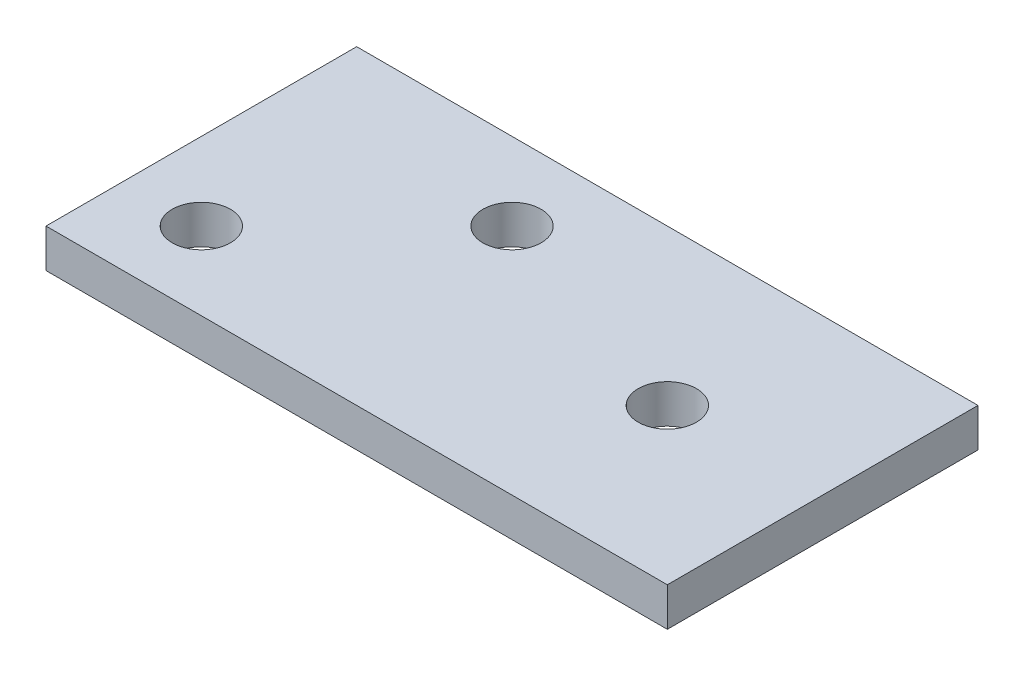
ISO-10303-21;
HEADER;
FILE_DESCRIPTION(('STEP AP214'),'2;1');
FILE_NAME('part.step','',(''),(''),'','','');
FILE_SCHEMA(('AUTOMOTIVE_DESIGN { 1 0 10303 214 1 1 1 1 }'));
ENDSEC;
DATA;
#1=APPLICATION_CONTEXT('core data for automotive mechanical design processes');
#2=APPLICATION_PROTOCOL_DEFINITION('international standard','automotive_design',2000,#1);
#3=PRODUCT_CONTEXT('',#1,'mechanical');
#4=PRODUCT('Part','Part','',(#3));
#5=PRODUCT_RELATED_PRODUCT_CATEGORY('part','',(#4));
#6=PRODUCT_DEFINITION_FORMATION('','',#4);
#7=PRODUCT_DEFINITION_CONTEXT('part definition',#1,'design');
#8=PRODUCT_DEFINITION('design','',#6,#7);
#9=PRODUCT_DEFINITION_SHAPE('','',#8);
#10=(LENGTH_UNIT() NAMED_UNIT(*) SI_UNIT(.MILLI.,.METRE.));
#11=(NAMED_UNIT(*) PLANE_ANGLE_UNIT() SI_UNIT($,.RADIAN.));
#12=(NAMED_UNIT(*) SI_UNIT($,.STERADIAN.) SOLID_ANGLE_UNIT());
#13=UNCERTAINTY_MEASURE_WITH_UNIT(LENGTH_MEASURE(1.E-05),#10,'distance_accuracy_value','');
#14=(GEOMETRIC_REPRESENTATION_CONTEXT(3) GLOBAL_UNCERTAINTY_ASSIGNED_CONTEXT((#13)) GLOBAL_UNIT_ASSIGNED_CONTEXT((#10,
#11,#12)) REPRESENTATION_CONTEXT('',''));
#15=CARTESIAN_POINT('',(0.,0.,0.));
#16=DIRECTION('',(0.,0.,1.));
#17=DIRECTION('',(1.,0.,0.));
#18=AXIS2_PLACEMENT_3D('',#15,#16,#17);
#19=CARTESIAN_POINT('',(50.8,6.31,-25.4));
#20=DIRECTION('',(-1.,0.,0.));
#21=DIRECTION('',(0.,0.,1.));
#22=AXIS2_PLACEMENT_3D('',#19,#20,#21);
#23=PLANE('',#22);
#24=DIRECTION('',(0.,0.,-1.));
#25=VECTOR('',#24,1.);
#26=CARTESIAN_POINT('',(50.8,0.,-25.4));
#27=LINE('',#26,#25);
#28=CARTESIAN_POINT('',(50.8,0.,25.4));
#29=VERTEX_POINT('',#28);
#30=CARTESIAN_POINT('',(50.8,0.,-25.4));
#31=VERTEX_POINT('',#30);
#32=EDGE_CURVE('E97',#29,#31,#27,.T.);
#33=ORIENTED_EDGE('',*,*,#32,.T.);
#34=DIRECTION('',(0.,-1.,0.));
#35=VECTOR('',#34,1.);
#36=CARTESIAN_POINT('',(50.8,6.31,-25.4));
#37=LINE('',#36,#35);
#38=CARTESIAN_POINT('',(50.8,6.31,-25.4));
#39=VERTEX_POINT('',#38);
#40=EDGE_CURVE('E11',#39,#31,#37,.T.);
#41=ORIENTED_EDGE('',*,*,#40,.F.);
#42=DIRECTION('',(0.,0.,-1.));
#43=VECTOR('',#42,1.);
#44=CARTESIAN_POINT('',(50.8,6.31,-25.4));
#45=LINE('',#44,#43);
#46=CARTESIAN_POINT('',(50.8,6.31,25.4));
#47=VERTEX_POINT('',#46);
#48=EDGE_CURVE('E84',#47,#39,#45,.T.);
#49=ORIENTED_EDGE('',*,*,#48,.F.);
#50=DIRECTION('',(0.,-1.,0.));
#51=VECTOR('',#50,1.);
#52=CARTESIAN_POINT('',(50.8,6.31,25.4));
#53=LINE('',#52,#51);
#54=EDGE_CURVE('E93',#47,#29,#53,.T.);
#55=ORIENTED_EDGE('',*,*,#54,.T.);
#56=EDGE_LOOP('',(#33,#41,#49,#55));
#57=FACE_BOUND('',#56,.T.);
#58=ADVANCED_FACE('F32',(#57),#23,.F.);
#59=CARTESIAN_POINT('',(-50.8,6.31,-25.4));
#60=DIRECTION('',(0.,0.,1.));
#61=DIRECTION('',(1.,0.,0.));
#62=AXIS2_PLACEMENT_3D('',#59,#60,#61);
#63=PLANE('',#62);
#64=DIRECTION('',(-1.,0.,0.));
#65=VECTOR('',#64,1.);
#66=CARTESIAN_POINT('',(-50.8,0.,-25.4));
#67=LINE('',#66,#65);
#68=CARTESIAN_POINT('',(-50.8,0.,-25.4));
#69=VERTEX_POINT('',#68);
#70=EDGE_CURVE('E88',#31,#69,#67,.T.);
#71=ORIENTED_EDGE('',*,*,#70,.T.);
#72=DIRECTION('',(0.,-1.,0.));
#73=VECTOR('',#72,1.);
#74=CARTESIAN_POINT('',(-50.8,6.31,-25.4));
#75=LINE('',#74,#73);
#76=CARTESIAN_POINT('',(-50.8,6.31,-25.4));
#77=VERTEX_POINT('',#76);
#78=EDGE_CURVE('E41',#77,#69,#75,.T.);
#79=ORIENTED_EDGE('',*,*,#78,.F.);
#80=DIRECTION('',(-1.,0.,0.));
#81=VECTOR('',#80,1.);
#82=CARTESIAN_POINT('',(-50.8,6.31,-25.4));
#83=LINE('',#82,#81);
#84=EDGE_CURVE('E79',#39,#77,#83,.T.);
#85=ORIENTED_EDGE('',*,*,#84,.F.);
#86=ORIENTED_EDGE('',*,*,#40,.T.);
#87=EDGE_LOOP('',(#71,#79,#85,#86));
#88=FACE_BOUND('',#87,.T.);
#89=ADVANCED_FACE('F87',(#88),#63,.F.);
#90=CARTESIAN_POINT('',(-50.8,6.31,-25.4));
#91=DIRECTION('',(1.,0.,0.));
#92=DIRECTION('',(0.,0.,-1.));
#93=AXIS2_PLACEMENT_3D('',#90,#91,#92);
#94=PLANE('',#93);
#95=DIRECTION('',(0.,0.,1.));
#96=VECTOR('',#95,1.);
#97=CARTESIAN_POINT('',(-50.8,0.,-25.4));
#98=LINE('',#97,#96);
#99=CARTESIAN_POINT('',(-50.8,0.,25.4));
#100=VERTEX_POINT('',#99);
#101=EDGE_CURVE('E66',#69,#100,#98,.T.);
#102=ORIENTED_EDGE('',*,*,#101,.T.);
#103=DIRECTION('',(0.,-1.,0.));
#104=VECTOR('',#103,1.);
#105=CARTESIAN_POINT('',(-50.8,6.31,25.4));
#106=LINE('',#105,#104);
#107=CARTESIAN_POINT('',(-50.8,6.31,25.4));
#108=VERTEX_POINT('',#107);
#109=EDGE_CURVE('E89',#108,#100,#106,.T.);
#110=ORIENTED_EDGE('',*,*,#109,.F.);
#111=DIRECTION('',(0.,0.,1.));
#112=VECTOR('',#111,1.);
#113=CARTESIAN_POINT('',(-50.8,6.31,-25.4));
#114=LINE('',#113,#112);
#115=EDGE_CURVE('E82',#77,#108,#114,.T.);
#116=ORIENTED_EDGE('',*,*,#115,.F.);
#117=ORIENTED_EDGE('',*,*,#78,.T.);
#118=EDGE_LOOP('',(#102,#110,#116,#117));
#119=FACE_BOUND('',#118,.T.);
#120=ADVANCED_FACE('F91',(#119),#94,.F.);
#121=CARTESIAN_POINT('',(-50.8,6.31,25.4));
#122=DIRECTION('',(0.,0.,-1.));
#123=DIRECTION('',(-1.,0.,0.));
#124=AXIS2_PLACEMENT_3D('',#121,#122,#123);
#125=PLANE('',#124);
#126=DIRECTION('',(1.,0.,0.));
#127=VECTOR('',#126,1.);
#128=CARTESIAN_POINT('',(-50.8,0.,25.4));
#129=LINE('',#128,#127);
#130=EDGE_CURVE('E72',#100,#29,#129,.T.);
#131=ORIENTED_EDGE('',*,*,#130,.T.);
#132=ORIENTED_EDGE('',*,*,#54,.F.);
#133=DIRECTION('',(1.,0.,0.));
#134=VECTOR('',#133,1.);
#135=CARTESIAN_POINT('',(-50.8,6.31,25.4));
#136=LINE('',#135,#134);
#137=EDGE_CURVE('E49',#108,#47,#136,.T.);
#138=ORIENTED_EDGE('',*,*,#137,.F.);
#139=ORIENTED_EDGE('',*,*,#109,.T.);
#140=EDGE_LOOP('',(#131,#132,#138,#139));
#141=FACE_BOUND('',#140,.T.);
#142=ADVANCED_FACE('F105',(#141),#125,.F.);
#143=CARTESIAN_POINT('',(0.,6.31,0.));
#144=DIRECTION('',(0.,1.,0.));
#145=DIRECTION('',(0.,0.,1.));
#146=AXIS2_PLACEMENT_3D('',#143,#144,#145);
#147=PLANE('',#146);
#148=CARTESIAN_POINT('',(25.4,6.31,0.));
#149=DIRECTION('',(0.,1.,0.));
#150=DIRECTION('',(0.,0.,1.));
#151=AXIS2_PLACEMENT_3D('',#148,#149,#150);
#152=CIRCLE('',#151,4.7625);
#153=CARTESIAN_POINT('',(25.4,6.31,4.7625));
#154=VERTEX_POINT('',#153);
#155=EDGE_CURVE('E122',#154,#154,#152,.T.);
#156=ORIENTED_EDGE('',*,*,#155,.F.);
#157=EDGE_LOOP('',(#156));
#158=FACE_BOUND('',#157,.T.);
#159=CARTESIAN_POINT('',(-12.7,6.31,-12.7));
#160=DIRECTION('',(0.,1.,0.));
#161=DIRECTION('',(0.,0.,1.));
#162=AXIS2_PLACEMENT_3D('',#159,#160,#161);
#163=CIRCLE('',#162,4.7625);
#164=CARTESIAN_POINT('',(-12.7,6.31,-7.9375));
#165=VERTEX_POINT('',#164);
#166=EDGE_CURVE('E117',#165,#165,#163,.T.);
#167=ORIENTED_EDGE('',*,*,#166,.F.);
#168=EDGE_LOOP('',(#167));
#169=FACE_BOUND('',#168,.T.);
#170=CARTESIAN_POINT('',(-38.1,6.31,12.7));
#171=DIRECTION('',(0.,1.,0.));
#172=DIRECTION('',(0.,0.,1.));
#173=AXIS2_PLACEMENT_3D('',#170,#171,#172);
#174=CIRCLE('',#173,4.7625);
#175=CARTESIAN_POINT('',(-38.1,6.31,17.4625));
#176=VERTEX_POINT('',#175);
#177=EDGE_CURVE('E111',#176,#176,#174,.T.);
#178=ORIENTED_EDGE('',*,*,#177,.F.);
#179=EDGE_LOOP('',(#178));
#180=FACE_BOUND('',#179,.T.);
#181=ORIENTED_EDGE('',*,*,#48,.T.);
#182=ORIENTED_EDGE('',*,*,#84,.T.);
#183=ORIENTED_EDGE('',*,*,#115,.T.);
#184=ORIENTED_EDGE('',*,*,#137,.T.);
#185=EDGE_LOOP('',(#181,#182,#183,#184));
#186=FACE_BOUND('',#185,.T.);
#187=ADVANCED_FACE('F80',(#158,#169,#180,#186),#147,.T.);
#188=CARTESIAN_POINT('',(0.,0.,0.));
#189=DIRECTION('',(0.,1.,0.));
#190=DIRECTION('',(0.,0.,1.));
#191=AXIS2_PLACEMENT_3D('',#188,#189,#190);
#192=PLANE('',#191);
#193=CARTESIAN_POINT('',(25.4,0.,0.));
#194=DIRECTION('',(0.,1.,0.));
#195=DIRECTION('',(0.,0.,1.));
#196=AXIS2_PLACEMENT_3D('',#193,#194,#195);
#197=CIRCLE('',#196,4.7625);
#198=CARTESIAN_POINT('',(25.4,0.,4.7625));
#199=VERTEX_POINT('',#198);
#200=EDGE_CURVE('E35',#199,#199,#197,.T.);
#201=ORIENTED_EDGE('',*,*,#200,.T.);
#202=EDGE_LOOP('',(#201));
#203=FACE_BOUND('',#202,.T.);
#204=CARTESIAN_POINT('',(-12.7,0.,-12.7));
#205=DIRECTION('',(0.,1.,0.));
#206=DIRECTION('',(0.,0.,1.));
#207=AXIS2_PLACEMENT_3D('',#204,#205,#206);
#208=CIRCLE('',#207,4.7625);
#209=CARTESIAN_POINT('',(-12.7,0.,-7.9375));
#210=VERTEX_POINT('',#209);
#211=EDGE_CURVE('E114',#210,#210,#208,.T.);
#212=ORIENTED_EDGE('',*,*,#211,.T.);
#213=EDGE_LOOP('',(#212));
#214=FACE_BOUND('',#213,.T.);
#215=CARTESIAN_POINT('',(-38.1,0.,12.7));
#216=DIRECTION('',(0.,1.,0.));
#217=DIRECTION('',(0.,0.,1.));
#218=AXIS2_PLACEMENT_3D('',#215,#216,#217);
#219=CIRCLE('',#218,4.7625);
#220=CARTESIAN_POINT('',(-38.1,0.,17.4625));
#221=VERTEX_POINT('',#220);
#222=EDGE_CURVE('E100',#221,#221,#219,.T.);
#223=ORIENTED_EDGE('',*,*,#222,.T.);
#224=EDGE_LOOP('',(#223));
#225=FACE_BOUND('',#224,.T.);
#226=ORIENTED_EDGE('',*,*,#32,.F.);
#227=ORIENTED_EDGE('',*,*,#130,.F.);
#228=ORIENTED_EDGE('',*,*,#101,.F.);
#229=ORIENTED_EDGE('',*,*,#70,.F.);
#230=EDGE_LOOP('',(#226,#227,#228,#229));
#231=FACE_BOUND('',#230,.T.);
#232=ADVANCED_FACE('F108',(#203,#214,#225,#231),#192,.F.);
#233=CARTESIAN_POINT('',(-38.1,0.,12.7));
#234=DIRECTION('',(0.,1.,0.));
#235=DIRECTION('',(0.,0.,1.));
#236=AXIS2_PLACEMENT_3D('',#233,#234,#235);
#237=CYLINDRICAL_SURFACE('',#236,4.7625);
#238=ORIENTED_EDGE('',*,*,#222,.F.);
#239=EDGE_LOOP('',(#238));
#240=FACE_BOUND('',#239,.T.);
#241=ORIENTED_EDGE('',*,*,#177,.T.);
#242=EDGE_LOOP('',(#241));
#243=FACE_BOUND('',#242,.T.);
#244=ADVANCED_FACE('F138',(#240,#243),#237,.F.);
#245=CARTESIAN_POINT('',(-12.7,0.,-12.7));
#246=DIRECTION('',(0.,1.,0.));
#247=DIRECTION('',(0.,0.,1.));
#248=AXIS2_PLACEMENT_3D('',#245,#246,#247);
#249=CYLINDRICAL_SURFACE('',#248,4.7625);
#250=ORIENTED_EDGE('',*,*,#211,.F.);
#251=EDGE_LOOP('',(#250));
#252=FACE_BOUND('',#251,.T.);
#253=ORIENTED_EDGE('',*,*,#166,.T.);
#254=EDGE_LOOP('',(#253));
#255=FACE_BOUND('',#254,.T.);
#256=ADVANCED_FACE('F133',(#252,#255),#249,.F.);
#257=CARTESIAN_POINT('',(25.4,-3.69,0.));
#258=DIRECTION('',(0.,1.,0.));
#259=DIRECTION('',(0.,0.,1.));
#260=AXIS2_PLACEMENT_3D('',#257,#258,#259);
#261=CYLINDRICAL_SURFACE('',#260,4.7625);
#262=ORIENTED_EDGE('',*,*,#155,.T.);
#263=EDGE_LOOP('',(#262));
#264=FACE_BOUND('',#263,.T.);
#265=ORIENTED_EDGE('',*,*,#200,.F.);
#266=EDGE_LOOP('',(#265));
#267=FACE_BOUND('',#266,.T.);
#268=ADVANCED_FACE('F131',(#264,#267),#261,.F.);
#269=CLOSED_SHELL('',(#58,#89,#120,#142,#187,#232,#244,#256,#268));
#270=MANIFOLD_SOLID_BREP('B2',#269);
#271=ADVANCED_BREP_SHAPE_REPRESENTATION('',(#18,#270),#14);
#272=SHAPE_DEFINITION_REPRESENTATION(#9,#271);
ENDSEC;
END-ISO-10303-21;
